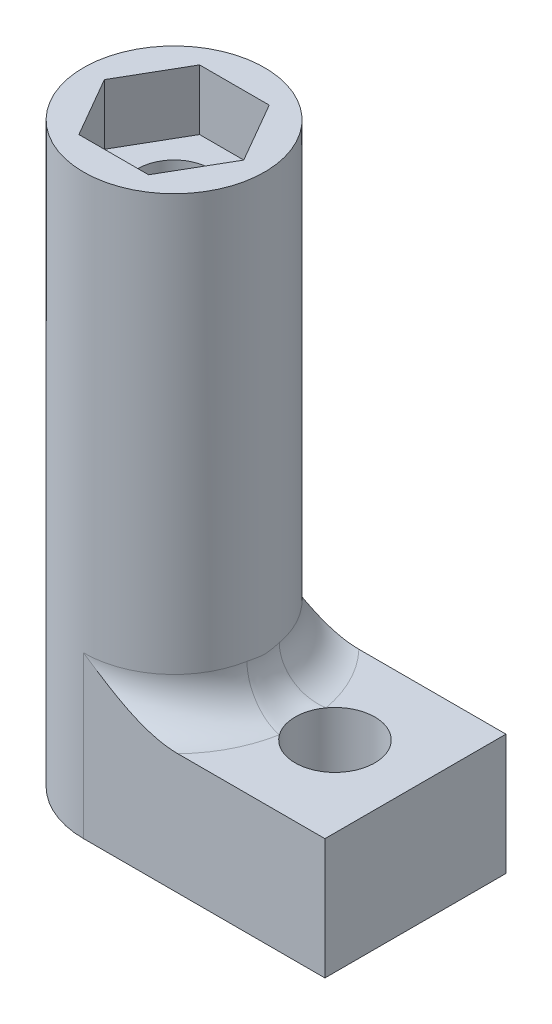
ISO-10303-21;
HEADER;
FILE_DESCRIPTION(('STEP AP214'),'2;1');
FILE_NAME('part.step','',(''),(''),'','','');
FILE_SCHEMA(('AUTOMOTIVE_DESIGN { 1 0 10303 214 1 1 1 1 }'));
ENDSEC;
DATA;
#1=APPLICATION_CONTEXT('core data for automotive mechanical design processes');
#2=APPLICATION_PROTOCOL_DEFINITION('international standard','automotive_design',2000,#1);
#3=PRODUCT_CONTEXT('',#1,'mechanical');
#4=PRODUCT('Part','Part','',(#3));
#5=PRODUCT_RELATED_PRODUCT_CATEGORY('part','',(#4));
#6=PRODUCT_DEFINITION_FORMATION('','',#4);
#7=PRODUCT_DEFINITION_CONTEXT('part definition',#1,'design');
#8=PRODUCT_DEFINITION('design','',#6,#7);
#9=PRODUCT_DEFINITION_SHAPE('','',#8);
#10=(LENGTH_UNIT() NAMED_UNIT(*) SI_UNIT(.MILLI.,.METRE.));
#11=(NAMED_UNIT(*) PLANE_ANGLE_UNIT() SI_UNIT($,.RADIAN.));
#12=(NAMED_UNIT(*) SI_UNIT($,.STERADIAN.) SOLID_ANGLE_UNIT());
#13=UNCERTAINTY_MEASURE_WITH_UNIT(LENGTH_MEASURE(1.E-05),#10,'distance_accuracy_value','');
#14=(GEOMETRIC_REPRESENTATION_CONTEXT(3) GLOBAL_UNCERTAINTY_ASSIGNED_CONTEXT((#13)) GLOBAL_UNIT_ASSIGNED_CONTEXT((#10,
#11,#12)) REPRESENTATION_CONTEXT('',''));
#15=CARTESIAN_POINT('',(0.,0.,0.));
#16=DIRECTION('',(0.,0.,1.));
#17=DIRECTION('',(1.,0.,0.));
#18=AXIS2_PLACEMENT_3D('',#15,#16,#17);
#19=CARTESIAN_POINT('',(0.,28.7,0.));
#20=DIRECTION('',(0.,-1.,0.));
#21=DIRECTION('',(0.,0.,-1.));
#22=AXIS2_PLACEMENT_3D('',#19,#20,#21);
#23=CYLINDRICAL_SURFACE('',#22,1.8);
#24=CARTESIAN_POINT('',(0.,0.,0.));
#25=DIRECTION('',(0.,1.,0.));
#26=DIRECTION('',(0.,0.,1.));
#27=AXIS2_PLACEMENT_3D('',#24,#25,#26);
#28=CIRCLE('',#27,1.8);
#29=CARTESIAN_POINT('',(0.,0.,1.8));
#30=VERTEX_POINT('',#29);
#31=EDGE_CURVE('E219',#30,#30,#28,.T.);
#32=ORIENTED_EDGE('',*,*,#31,.F.);
#33=EDGE_LOOP('',(#32));
#34=FACE_BOUND('',#33,.T.);
#35=CARTESIAN_POINT('',(0.,25.7,0.));
#36=DIRECTION('',(0.,1.,0.));
#37=DIRECTION('',(0.,0.,1.));
#38=AXIS2_PLACEMENT_3D('',#35,#36,#37);
#39=CIRCLE('',#38,1.8);
#40=CARTESIAN_POINT('',(0.,25.7,1.8));
#41=VERTEX_POINT('',#40);
#42=EDGE_CURVE('E44',#41,#41,#39,.T.);
#43=ORIENTED_EDGE('',*,*,#42,.T.);
#44=EDGE_LOOP('',(#43));
#45=FACE_BOUND('',#44,.T.);
#46=ADVANCED_FACE('F39',(#34,#45),#23,.F.);
#47=CARTESIAN_POINT('',(0.,28.7,0.));
#48=DIRECTION('',(0.,-1.,0.));
#49=DIRECTION('',(0.,0.,-1.));
#50=AXIS2_PLACEMENT_3D('',#47,#48,#49);
#51=CYLINDRICAL_SURFACE('',#50,4.5);
#52=CARTESIAN_POINT('',(0.,28.7,0.));
#53=DIRECTION('',(0.,1.,0.));
#54=DIRECTION('',(0.,0.,1.));
#55=AXIS2_PLACEMENT_3D('',#52,#53,#54);
#56=CIRCLE('',#55,4.5);
#57=CARTESIAN_POINT('',(0.,28.7,4.5));
#58=VERTEX_POINT('',#57);
#59=EDGE_CURVE('E229',#58,#58,#56,.T.);
#60=ORIENTED_EDGE('',*,*,#59,.F.);
#61=EDGE_LOOP('',(#60));
#62=FACE_BOUND('',#61,.T.);
#63=CARTESIAN_POINT('',(0.,8.,0.));
#64=DIRECTION('',(0.,1.,0.));
#65=DIRECTION('',(0.,0.,1.));
#66=AXIS2_PLACEMENT_3D('',#63,#64,#65);
#67=CIRCLE('',#66,4.5);
#68=CARTESIAN_POINT('',(4.42772307692308,8.,-0.80328597279103));
#69=VERTEX_POINT('',#68);
#70=CARTESIAN_POINT('',(0.,8.,-4.5));
#71=VERTEX_POINT('',#70);
#72=EDGE_CURVE('E244',#69,#71,#67,.T.);
#73=ORIENTED_EDGE('',*,*,#72,.T.);
#74=DIRECTION('',(0.,-1.,0.));
#75=VECTOR('',#74,1.);
#76=CARTESIAN_POINT('',(0.,6.,-4.5));
#77=LINE('',#76,#75);
#78=CARTESIAN_POINT('',(0.,0.,-4.5));
#79=VERTEX_POINT('',#78);
#80=EDGE_CURVE('E208',#71,#79,#77,.T.);
#81=ORIENTED_EDGE('',*,*,#80,.T.);
#82=CARTESIAN_POINT('',(0.,0.,0.));
#83=DIRECTION('',(0.,1.,0.));
#84=DIRECTION('',(0.,0.,1.));
#85=AXIS2_PLACEMENT_3D('',#82,#83,#84);
#86=CIRCLE('',#85,4.5);
#87=CARTESIAN_POINT('',(0.,0.,4.5));
#88=VERTEX_POINT('',#87);
#89=EDGE_CURVE('E228',#79,#88,#86,.T.);
#90=ORIENTED_EDGE('',*,*,#89,.T.);
#91=DIRECTION('',(0.,-1.,0.));
#92=VECTOR('',#91,1.);
#93=CARTESIAN_POINT('',(0.,6.,4.5));
#94=LINE('',#93,#92);
#95=CARTESIAN_POINT('',(0.,8.,4.5));
#96=VERTEX_POINT('',#95);
#97=EDGE_CURVE('E216',#96,#88,#94,.T.);
#98=ORIENTED_EDGE('',*,*,#97,.F.);
#99=CARTESIAN_POINT('',(0.,8.,0.));
#100=DIRECTION('',(0.,1.,0.));
#101=DIRECTION('',(0.,0.,1.));
#102=AXIS2_PLACEMENT_3D('',#99,#100,#101);
#103=CIRCLE('',#102,4.5);
#104=CARTESIAN_POINT('',(4.42772307692308,8.,0.80328597279103));
#105=VERTEX_POINT('',#104);
#106=EDGE_CURVE('E232',#96,#105,#103,.T.);
#107=ORIENTED_EDGE('',*,*,#106,.T.);
#108=CARTESIAN_POINT('',(4.32180042427934,7.92471685230345,1.25381062872305));
#109=CARTESIAN_POINT('',(4.47510886143326,5.71891832927366,0.725366816269322));
#110=CARTESIAN_POINT('',(6.62113793164979,6.,1.42096424883421));
#111=CARTESIAN_POINT('',(4.33523591986656,7.94212315378226,1.20753497902267));
#112=CARTESIAN_POINT('',(4.46203875305326,5.73817036351061,0.7490338847614));
#113=CARTESIAN_POINT('',(6.60282875781481,6.,1.40308878355294));
#114=CARTESIAN_POINT('',(4.34805817582105,7.95613015598346,1.16052585616582));
#115=CARTESIAN_POINT('',(4.45160158603136,5.76214166284144,0.769767952560044));
#116=CARTESIAN_POINT('',(6.58263930037659,6.,1.38290576627567));
#117=CARTESIAN_POINT('',(4.3722686689692,7.97805237679869,1.06565920912241));
#118=CARTESIAN_POINT('',(4.43604768902022,5.81701038067024,0.801181415969872));
#119=CARTESIAN_POINT('',(6.53870020330049,6.,1.33645318278953));
#120=CARTESIAN_POINT('',(4.38366226264996,7.9859909557779,1.01780567127564));
#121=CARTESIAN_POINT('',(4.43086731244596,5.84770296680902,0.811977813055372));
#122=CARTESIAN_POINT('',(6.51496464080291,6.,1.31020746852908));
#123=CARTESIAN_POINT('',(4.40491431850641,7.99660618725926,0.921503916477526));
#124=CARTESIAN_POINT('',(4.42548141469891,5.91357744562705,0.820328026151139));
#125=CARTESIAN_POINT('',(6.46399020166853,6.,1.25004372152428));
#126=CARTESIAN_POINT('',(4.41477278054274,7.99928283928371,0.87305569947219));
#127=CARTESIAN_POINT('',(4.42520607987305,5.94860022108697,0.818075814062893));
#128=CARTESIAN_POINT('',(6.43675132471371,6.,1.21612568808343));
#129=CARTESIAN_POINT('',(4.43290224829821,8.00046293973174,0.775776186303025));
#130=CARTESIAN_POINT('',(4.42853307521237,6.01980461750034,0.798233392250163));
#131=CARTESIAN_POINT('',(6.37948055108787,6.,1.13870351128674));
#132=CARTESIAN_POINT('',(4.44117075546338,7.99895987627455,0.726944410707282));
#133=CARTESIAN_POINT('',(4.43207096753054,6.05590388052615,0.780904070563555));
#134=CARTESIAN_POINT('',(6.34944436672314,6.,1.09518450709456));
#135=CARTESIAN_POINT('',(4.45657697338765,7.99289901335368,0.625866171314704));
#136=CARTESIAN_POINT('',(4.44184370002867,6.12809504240349,0.728543863395617));
#137=CARTESIAN_POINT('',(6.2861319446575,6.,0.993419862861029));
#138=CARTESIAN_POINT('',(4.46360246549781,7.98814413865479,0.573609207292893));
#139=CARTESIAN_POINT('',(4.4481951216501,6.16409787428863,0.69273330833869));
#140=CARTESIAN_POINT('',(6.25277322611751,6.,0.934385532128751));
#141=CARTESIAN_POINT('',(4.47581067378113,7.97727685072966,0.468932267480221));
#142=CARTESIAN_POINT('',(4.46155549040423,6.2297689751202,0.603912956766487));
#143=CARTESIAN_POINT('',(6.18800774417006,6.,0.801575262164426));
#144=CARTESIAN_POINT('',(4.48099253354884,7.97116380874278,0.416512227312223));
#145=CARTESIAN_POINT('',(4.46856234330022,6.25959826683878,0.551146805101261));
#146=CARTESIAN_POINT('',(6.1566018934854,6.,0.727792496768121));
#147=CARTESIAN_POINT('',(4.48950803560009,7.95964779875837,0.311580864753093));
#148=CARTESIAN_POINT('',(4.48123832986636,6.30989300008078,0.431696422450978));
#149=CARTESIAN_POINT('',(6.1006751688472,6.,0.565894183702304));
#150=CARTESIAN_POINT('',(4.49284516163185,7.95424350712863,0.259069903580956));
#151=CARTESIAN_POINT('',(4.4869552330347,6.33061723994682,0.365014961031779));
#152=CARTESIAN_POINT('',(6.07614136070009,6.,0.477806061485372));
#153=CARTESIAN_POINT('',(4.49767590330357,7.94597848143442,0.1538840689281));
#154=CARTESIAN_POINT('',(4.49551486225801,6.36079780815635,0.223000106056842));
#155=CARTESIAN_POINT('',(6.03921777904871,6.,0.291066790526567));
#156=CARTESIAN_POINT('',(4.49917052182178,7.94311636389997,0.101209300275258));
#157=CARTESIAN_POINT('',(4.49841517335574,6.37046886948605,0.147292316272926));
#158=CARTESIAN_POINT('',(6.0268213998892,6.,0.192421419910748));
#159=CARTESIAN_POINT('',(4.50030810473435,7.94096531105202,-0.0043358493317173));
#160=CARTESIAN_POINT('',(4.50058451138219,6.37774822959696,-0.00598485522887827));
#161=CARTESIAN_POINT('',(6.01747702604967,6.,-0.00796277259526935));
#162=CARTESIAN_POINT('',(4.49994627919025,7.94168561885266,-0.057206384229607));
#163=CARTESIAN_POINT('',(4.49986191039031,6.37538463692708,-0.0841784811282364));
#164=CARTESIAN_POINT('',(6.02056899342626,6.,-0.109708922750003));
#165=CARTESIAN_POINT('',(4.49736319607796,7.94645438068749,-0.162844082342372));
#166=CARTESIAN_POINT('',(4.49502164576732,6.35894958836597,-0.234932236048796));
#167=CARTESIAN_POINT('',(6.04141547754563,6.,-0.306984897528114));
#168=CARTESIAN_POINT('',(4.49514111523834,7.95050430825829,-0.215611189418985));
#169=CARTESIAN_POINT('',(4.49086477271746,6.34474392058083,-0.308047166703401));
#170=CARTESIAN_POINT('',(6.05917648614752,6.,-0.402511949660956));
#171=CARTESIAN_POINT('',(4.48884442408562,7.96050155064278,-0.321048710162209));
#172=CARTESIAN_POINT('',(4.4803068935065,6.30610423060991,-0.442865128437513));
#173=CARTESIAN_POINT('',(6.10491864478294,6.,-0.581070351799525));
#174=CARTESIAN_POINT('',(4.48476591922338,7.96645284642917,-0.373718685642546));
#175=CARTESIAN_POINT('',(4.47384260739006,6.28140899511805,-0.504787267728609));
#176=CARTESIAN_POINT('',(6.13292125604916,6.,-0.664074941335284));
#177=CARTESIAN_POINT('',(4.47475847645297,7.97823527742968,-0.478878876969836));
#178=CARTESIAN_POINT('',(4.46040129792344,6.2241786517087,-0.61318990521744));
#179=CARTESIAN_POINT('',(6.19369357568633,6.,-0.815060408123387));
#180=CARTESIAN_POINT('',(4.46883002553984,7.98406644383749,-0.531369136454469));
#181=CARTESIAN_POINT('',(4.45339483224755,6.19142135385402,-0.659572742060315));
#182=CARTESIAN_POINT('',(6.22646202824723,6.,-0.883045231267346));
#183=CARTESIAN_POINT('',(4.45901674316692,7.99087391904611,-0.606373175045757));
#184=CARTESIAN_POINT('',(4.44444530095814,6.14143084517406,-0.713275503726772));
#185=CARTESIAN_POINT('',(6.27369019983918,6.,-0.970123053579248));
#186=CARTESIAN_POINT('',(4.4558887517774,7.99272463971259,-0.628947637904187));
#187=CARTESIAN_POINT('',(4.44187172309975,6.12583751599385,-0.727890188669028));
#188=CARTESIAN_POINT('',(6.28795739854506,6.,-0.995023101981734));
#189=CARTESIAN_POINT('',(4.44928727565521,7.9958793669301,-0.674064227137648));
#190=CARTESIAN_POINT('',(4.43714916207272,6.09404582950308,-0.753847009694182));
#191=CARTESIAN_POINT('',(6.31634553103905,6.,-1.04233828127117));
#192=CARTESIAN_POINT('',(4.44581379016048,7.99718337227521,-0.696606353441243));
#193=CARTESIAN_POINT('',(4.43500394570287,6.07784319592814,-0.765160409118393));
#194=CARTESIAN_POINT('',(6.33046646450447,6.,-1.06475340667689));
#195=CARTESIAN_POINT('',(4.43488800383689,8.00005763490421,-0.764096355939794));
#196=CARTESIAN_POINT('',(4.42942377462029,6.02863782980248,-0.794250405769169));
#197=CARTESIAN_POINT('',(6.37224208492811,6.,-1.12844492389823));
#198=CARTESIAN_POINT('',(4.42691994992472,8.00059838017491,-0.80898754530961));
#199=CARTESIAN_POINT('',(4.42691272882663,5.99540220543019,-0.806808607347992));
#200=CARTESIAN_POINT('',(6.39936128069318,6.,-1.16625875091839));
#201=CARTESIAN_POINT('',(4.40964683609337,7.99792463659456,-0.898375176773174));
#202=CARTESIAN_POINT('',(4.42530713968846,5.93039150429781,-0.819576115140711));
#203=CARTESIAN_POINT('',(6.45101689165427,6.,-1.23405003826739));
#204=CARTESIAN_POINT('',(4.40034462109513,7.99471803701689,-0.942872250177293));
#205=CARTESIAN_POINT('',(4.42626203888824,5.89869358965328,-0.819600646386153));
#206=CARTESIAN_POINT('',(6.47555861482139,6.,-1.26404379979915));
#207=CARTESIAN_POINT('',(4.38042824262163,7.98378447080364,-1.03147018224221));
#208=CARTESIAN_POINT('',(4.43225679565825,5.83887818173679,-0.80908606857316));
#209=CARTESIAN_POINT('',(6.52180392693491,6.,-1.31777101673479));
#210=CARTESIAN_POINT('',(4.3698093697282,7.97604088580106,-1.07556897591413));
#211=CARTESIAN_POINT('',(4.43736376326885,5.81090117842068,-0.798367153839786));
#212=CARTESIAN_POINT('',(6.54349672117354,6.,-1.3414809893378));
#213=CARTESIAN_POINT('',(4.35858563114795,7.96564735635359,-1.11925479491967));
#214=CARTESIAN_POINT('',(4.44480341319623,5.78621769971489,-0.783506770706757));
#215=CARTESIAN_POINT('',(6.56351217936984,6.,-1.36268218641809));
#216=(BOUNDED_SURFACE() B_SPLINE_SURFACE(3,2,((#108,#109,#110),(#111,#112,#113),(#114,#115,
#116),(#117,#118,#119),(#120,#121,#122),(#123,#124,#125),(#126,#127,#128),(#129,#130,#131),
(#132,#133,#134),(#135,#136,#137),(#138,#139,#140),(#141,#142,#143),(#144,#145,#146),(#147,#148,
#149),(#150,#151,#152),(#153,#154,#155),(#156,#157,#158),(#159,#160,#161),(#162,#163,#164),
(#165,#166,#167),(#168,#169,#170),(#171,#172,#173),(#174,#175,#176),(#177,#178,#179),(#180,#181,
#182),(#183,#184,#185),(#186,#187,#188),(#189,#190,#191),(#192,#193,#194),(#195,#196,#197),
(#198,#199,#200),(#201,#202,#203),(#204,#205,#206),(#207,#208,#209),(#210,#211,#212),(#213,#214,
#215)),.UNSPECIFIED.,.F.,.F.,.F.) B_SPLINE_SURFACE_WITH_KNOTS((4,2,2,2,2,2,2,2,2,2,2,2,2,2,2,2,
2,4),(3,3),(0.,0.21503532792247,0.429238650825709,0.643441993174441,0.857979245277317,
1.08682698202551,1.31578088492312,1.54430092214241,1.77269652073123,2.00168171432519,
2.2307683008213,2.4603377137437,2.68984674383218,2.78875252927018,2.88765853286951,
3.08512177358291,3.28217004335128,3.47994462694238),(0.,1.),
.UNSPECIFIED.) GEOMETRIC_REPRESENTATION_ITEM() RATIONAL_B_SPLINE_SURFACE(((1.,0.660519290641002,
1.),(1.,0.663804819785435,1.),(1.,0.667688306752048,1.),(1.,0.676513938999184,1.),(1.,
0.681451930029375,1.),(1.,0.692276608244784,1.),(1.,0.698163295516125,1.),(1.,0.710607402000421,
1.),(1.,0.717165852475705,1.),(1.,0.73094317488497,1.),(1.,0.738176918255722,1.),(1.,
0.752104710537283,1.),(1.,0.758798507518311,1.),(1.,0.770619770639632,1.),(1.,0.775750180926034,
1.),(1.,0.783435848715463,1.),(1.,0.785992506974603,1.),(1.,0.787922015486865,1.),(1.,
0.787286629816923,1.),(1.,0.782973418654017,1.),(1.,0.779294246116418,1.),(1.,0.769721500730478,
1.),(1.,0.7638232771209,1.),(1.,0.750887668903448,1.),(1.,0.743850584333137,1.),(1.,
0.733635508547674,1.),(1.,0.730540254675541,1.),(1.,0.724370159771713,1.),(1.,0.72129531878506,
1.),(1.,0.712193287651683,1.),(1.,0.70627735299664,1.),(1.,0.69508264641754,1.),(1.,
0.68980256161653,1.),(1.,0.680025589146032,1.),(1.,0.675531660054101,1.),(1.,0.671531481599833,1.))) REPRESENTATION_ITEM('') SURFACE());
#217=CARTESIAN_POINT('',(4.32180042427934,7.92471685230345,1.25381062872305));
#218=CARTESIAN_POINT('',(4.33523591986656,7.94212315378226,1.20753497902267));
#219=CARTESIAN_POINT('',(4.34805817582105,7.95613015598346,1.16052585616582));
#220=CARTESIAN_POINT('',(4.3722686689692,7.97805237679869,1.06565920912241));
#221=CARTESIAN_POINT('',(4.38366226264996,7.9859909557779,1.01780567127564));
#222=CARTESIAN_POINT('',(4.40491431850641,7.99660618725926,0.921503916477526));
#223=CARTESIAN_POINT('',(4.41477278054274,7.99928283928371,0.87305569947219));
#224=CARTESIAN_POINT('',(4.43290224829821,8.00046293973174,0.775776186303025));
#225=CARTESIAN_POINT('',(4.44117075546338,7.99895987627455,0.726944410707282));
#226=CARTESIAN_POINT('',(4.45657697338766,7.99289901335368,0.625866171314704));
#227=CARTESIAN_POINT('',(4.46360246549781,7.98814413865479,0.573609207292893));
#228=CARTESIAN_POINT('',(4.47581067378113,7.97727685072966,0.468932267480221));
#229=CARTESIAN_POINT('',(4.48099253354884,7.97116380874278,0.416512227312223));
#230=CARTESIAN_POINT('',(4.48950803560009,7.95964779875837,0.311580864753093));
#231=CARTESIAN_POINT('',(4.49284516163185,7.95424350712863,0.259069903580956));
#232=CARTESIAN_POINT('',(4.49767590330357,7.94597848143442,0.1538840689281));
#233=CARTESIAN_POINT('',(4.49917052182179,7.94311636389997,0.101209300275258));
#234=CARTESIAN_POINT('',(4.50030810473435,7.94096531105202,-0.00433584933171725));
#235=CARTESIAN_POINT('',(4.49994627919025,7.94168561885266,-0.0572063842296069));
#236=CARTESIAN_POINT('',(4.49736319607796,7.94645438068749,-0.162844082342372));
#237=CARTESIAN_POINT('',(4.49514111523834,7.95050430825829,-0.215611189418986));
#238=CARTESIAN_POINT('',(4.48884442408562,7.96050155064278,-0.321048710162209));
#239=CARTESIAN_POINT('',(4.48476591922338,7.96645284642917,-0.373718685642546));
#240=CARTESIAN_POINT('',(4.47475847645297,7.97823527742968,-0.478878876969836));
#241=CARTESIAN_POINT('',(4.46883002553984,7.98406644383749,-0.531369136454469));
#242=CARTESIAN_POINT('',(4.45901674316692,7.99087391904611,-0.606373175045757));
#243=CARTESIAN_POINT('',(4.4558887517774,7.99272463971259,-0.628947637904187));
#244=CARTESIAN_POINT('',(4.44928727565521,7.9958793669301,-0.674064227137648));
#245=CARTESIAN_POINT('',(4.44581379016048,7.99718337227521,-0.696606353441243));
#246=CARTESIAN_POINT('',(4.43488800383689,8.00005763490421,-0.764096355939795));
#247=CARTESIAN_POINT('',(4.42691994992472,8.00059838017491,-0.80898754530961));
#248=CARTESIAN_POINT('',(4.40964683609337,7.99792463659456,-0.898375176773174));
#249=CARTESIAN_POINT('',(4.40034462109513,7.99471803701689,-0.942872250177293));
#250=CARTESIAN_POINT('',(4.38042824262163,7.98378447080364,-1.03147018224221));
#251=CARTESIAN_POINT('',(4.36980936972821,7.97604088580106,-1.07556897591413));
#252=CARTESIAN_POINT('',(4.35858563114795,7.96564735635359,-1.11925479491967));
#253=B_SPLINE_CURVE_WITH_KNOTS('',3,(#217,#218,#219,#220,#221,#222,#223,#224,#225,#226,#227,
#228,#229,#230,#231,#232,#233,#234,#235,#236,#237,#238,#239,#240,#241,#242,#243,#244,#245,#246,
#247,#248,#249,#250,#251,#252),.UNSPECIFIED.,.F.,.F.,(4,2,2,2,2,2,2,2,2,2,2,2,2,2,2,2,2,4),(0.,
0.21503532792247,0.429238650825709,0.643441993174441,0.857979245277317,1.08682698202551,
1.31578088492312,1.54430092214241,1.77269652073123,2.00168171432519,2.2307683008213,
2.4603377137437,2.68984674383218,2.78875252927018,2.88765853286951,3.08512177358291,
3.28217004335128,3.47994462694238),.UNSPECIFIED.);
#254=EDGE_CURVE('E236',#105,#69,#253,.T.);
#255=ORIENTED_EDGE('',*,*,#254,.T.);
#256=EDGE_LOOP('',(#73,#81,#90,#98,#107,#255));
#257=FACE_BOUND('',#256,.T.);
#258=ADVANCED_FACE('F246',(#62,#257),#51,.T.);
#259=CARTESIAN_POINT('',(0.,28.7,0.));
#260=DIRECTION('',(0.,1.,0.));
#261=DIRECTION('',(0.,0.,1.));
#262=AXIS2_PLACEMENT_3D('',#259,#260,#261);
#263=PLANE('',#262);
#264=DIRECTION('',(-0.5,0.,-0.866025403784438));
#265=VECTOR('',#264,1.);
#266=CARTESIAN_POINT('',(3.46410161513775,28.7,0.));
#267=LINE('',#266,#265);
#268=CARTESIAN_POINT('',(3.46410161513775,28.7,0.));
#269=VERTEX_POINT('',#268);
#270=CARTESIAN_POINT('',(1.73205080756888,28.7,-3.));
#271=VERTEX_POINT('',#270);
#272=EDGE_CURVE('E57',#269,#271,#267,.T.);
#273=ORIENTED_EDGE('',*,*,#272,.F.);
#274=DIRECTION('',(0.5,0.,-0.866025403784439));
#275=VECTOR('',#274,1.);
#276=CARTESIAN_POINT('',(1.73205080756888,28.7,3.));
#277=LINE('',#276,#275);
#278=CARTESIAN_POINT('',(1.73205080756888,28.7,3.));
#279=VERTEX_POINT('',#278);
#280=EDGE_CURVE('E157',#279,#269,#277,.T.);
#281=ORIENTED_EDGE('',*,*,#280,.F.);
#282=DIRECTION('',(1.,0.,0.));
#283=VECTOR('',#282,1.);
#284=CARTESIAN_POINT('',(-1.73205080756888,28.7,3.));
#285=LINE('',#284,#283);
#286=CARTESIAN_POINT('',(-1.73205080756888,28.7,3.));
#287=VERTEX_POINT('',#286);
#288=EDGE_CURVE('E160',#287,#279,#285,.T.);
#289=ORIENTED_EDGE('',*,*,#288,.F.);
#290=DIRECTION('',(0.5,0.,0.866025403784438));
#291=VECTOR('',#290,1.);
#292=CARTESIAN_POINT('',(-3.46410161513775,28.7,0.));
#293=LINE('',#292,#291);
#294=CARTESIAN_POINT('',(-3.46410161513775,28.7,0.));
#295=VERTEX_POINT('',#294);
#296=EDGE_CURVE('E176',#295,#287,#293,.T.);
#297=ORIENTED_EDGE('',*,*,#296,.F.);
#298=DIRECTION('',(-0.499999999999999,0.,0.866025403784439));
#299=VECTOR('',#298,1.);
#300=CARTESIAN_POINT('',(-1.73205080756888,28.7,-3.));
#301=LINE('',#300,#299);
#302=CARTESIAN_POINT('',(-1.73205080756888,28.7,-3.));
#303=VERTEX_POINT('',#302);
#304=EDGE_CURVE('E173',#303,#295,#301,.T.);
#305=ORIENTED_EDGE('',*,*,#304,.F.);
#306=DIRECTION('',(-1.,0.,0.));
#307=VECTOR('',#306,1.);
#308=CARTESIAN_POINT('',(1.73205080756888,28.7,-3.));
#309=LINE('',#308,#307);
#310=EDGE_CURVE('E171',#271,#303,#309,.T.);
#311=ORIENTED_EDGE('',*,*,#310,.F.);
#312=EDGE_LOOP('',(#273,#281,#289,#297,#305,#311));
#313=FACE_BOUND('',#312,.T.);
#314=ORIENTED_EDGE('',*,*,#59,.T.);
#315=EDGE_LOOP('',(#314));
#316=FACE_BOUND('',#315,.T.);
#317=ADVANCED_FACE('F306',(#313,#316),#263,.T.);
#318=CARTESIAN_POINT('',(0.,0.,0.));
#319=DIRECTION('',(0.,1.,0.));
#320=DIRECTION('',(0.,0.,1.));
#321=AXIS2_PLACEMENT_3D('',#318,#319,#320);
#322=PLANE('',#321);
#323=CARTESIAN_POINT('',(8.,0.,0.));
#324=DIRECTION('',(0.,-1.,0.));
#325=DIRECTION('',(0.,0.,-1.));
#326=AXIS2_PLACEMENT_3D('',#323,#324,#325);
#327=CIRCLE('',#326,1.98);
#328=CARTESIAN_POINT('',(8.,0.,-1.98));
#329=VERTEX_POINT('',#328);
#330=EDGE_CURVE('E190',#329,#329,#327,.T.);
#331=ORIENTED_EDGE('',*,*,#330,.F.);
#332=EDGE_LOOP('',(#331));
#333=FACE_BOUND('',#332,.T.);
#334=ORIENTED_EDGE('',*,*,#89,.F.);
#335=DIRECTION('',(1.,0.,0.));
#336=VECTOR('',#335,1.);
#337=CARTESIAN_POINT('',(12.,0.,-4.5));
#338=LINE('',#337,#336);
#339=CARTESIAN_POINT('',(12.,0.,-4.5));
#340=VERTEX_POINT('',#339);
#341=EDGE_CURVE('E198',#79,#340,#338,.T.);
#342=ORIENTED_EDGE('',*,*,#341,.T.);
#343=DIRECTION('',(0.,0.,1.));
#344=VECTOR('',#343,1.);
#345=CARTESIAN_POINT('',(12.,0.,4.5));
#346=LINE('',#345,#344);
#347=CARTESIAN_POINT('',(12.,0.,4.5));
#348=VERTEX_POINT('',#347);
#349=EDGE_CURVE('E211',#340,#348,#346,.T.);
#350=ORIENTED_EDGE('',*,*,#349,.T.);
#351=DIRECTION('',(-1.,0.,0.));
#352=VECTOR('',#351,1.);
#353=CARTESIAN_POINT('',(0.,0.,4.5));
#354=LINE('',#353,#352);
#355=EDGE_CURVE('E202',#348,#88,#354,.T.);
#356=ORIENTED_EDGE('',*,*,#355,.T.);
#357=EDGE_LOOP('',(#334,#342,#350,#356));
#358=FACE_BOUND('',#357,.T.);
#359=ORIENTED_EDGE('',*,*,#31,.T.);
#360=EDGE_LOOP('',(#359));
#361=FACE_BOUND('',#360,.T.);
#362=ADVANCED_FACE('F293',(#333,#358,#361),#322,.F.);
#363=CARTESIAN_POINT('',(0.,6.,4.5));
#364=DIRECTION('',(0.,0.,1.));
#365=DIRECTION('',(1.,0.,0.));
#366=AXIS2_PLACEMENT_3D('',#363,#364,#365);
#367=PLANE('',#366);
#368=ORIENTED_EDGE('',*,*,#355,.F.);
#369=DIRECTION('',(0.,-1.,0.));
#370=VECTOR('',#369,1.);
#371=CARTESIAN_POINT('',(12.,6.,4.5));
#372=LINE('',#371,#370);
#373=CARTESIAN_POINT('',(12.,6.,4.5));
#374=VERTEX_POINT('',#373);
#375=EDGE_CURVE('E220',#374,#348,#372,.T.);
#376=ORIENTED_EDGE('',*,*,#375,.F.);
#377=DIRECTION('',(-1.,0.,0.));
#378=VECTOR('',#377,1.);
#379=CARTESIAN_POINT('',(0.,6.,4.5));
#380=LINE('',#379,#378);
#381=CARTESIAN_POINT('',(4.69041575982343,6.,4.5));
#382=VERTEX_POINT('',#381);
#383=EDGE_CURVE('E205',#374,#382,#380,.T.);
#384=ORIENTED_EDGE('',*,*,#383,.T.);
#385=CARTESIAN_POINT('',(4.69041575982343,6.,4.5));
#386=CARTESIAN_POINT('',(4.56338799354628,6.00001629945652,4.5));
#387=CARTESIAN_POINT('',(4.43651728645573,6.00629690124301,4.5));
#388=CARTESIAN_POINT('',(4.18405485721427,6.0299789451764,4.5));
#389=CARTESIAN_POINT('',(4.05846108370906,6.04735810798877,4.5));
#390=CARTESIAN_POINT('',(3.68861101421824,6.11330867880104,4.5));
#391=CARTESIAN_POINT('',(3.44683013416413,6.17579614695564,4.5));
#392=CARTESIAN_POINT('',(2.92162772576583,6.34549368961101,4.5));
#393=CARTESIAN_POINT('',(2.64048069270811,6.45944513803349,4.5));
#394=CARTESIAN_POINT('',(2.09122390251144,6.71566547248007,4.5));
#395=CARTESIAN_POINT('',(1.82314044482931,6.85798876486459,4.5));
#396=CARTESIAN_POINT('',(1.2949255005519,7.16131052871333,4.5));
#397=CARTESIAN_POINT('',(1.03488315666197,7.32246027688379,4.5));
#398=CARTESIAN_POINT('',(0.520265873478311,7.65324006647528,4.5));
#399=CARTESIAN_POINT('',(0.26569267806667,7.82287275701892,4.5));
#400=CARTESIAN_POINT('',(0.00744208331612124,7.99503861232405,4.5));
#401=CARTESIAN_POINT('',(0.00372104126172573,7.99751930705951,4.5));
#402=CARTESIAN_POINT('',(0.,8.,4.5));
#403=B_SPLINE_CURVE_WITH_KNOTS('',3,(#385,#386,#387,#388,#389,#390,#391,#392,#393,#394,#395,
#396,#397,#398,#399,#400,#401,#402),.UNSPECIFIED.,.F.,.F.,(4,2,2,2,2,2,2,2,4),(0.,
0.380689018588808,0.760616231132244,1.5072612716087,2.4150430104358,3.32458256973669,
4.24201127100227,5.15972828567752,5.17314469354255),.UNSPECIFIED.);
#404=EDGE_CURVE('E11',#382,#96,#403,.T.);
#405=ORIENTED_EDGE('',*,*,#404,.T.);
#406=ORIENTED_EDGE('',*,*,#97,.T.);
#407=EDGE_LOOP('',(#368,#376,#384,#405,#406));
#408=FACE_BOUND('',#407,.T.);
#409=ADVANCED_FACE('F288',(#408),#367,.T.);
#410=CARTESIAN_POINT('',(12.,6.,4.5));
#411=DIRECTION('',(1.,0.,0.));
#412=DIRECTION('',(0.,0.,-1.));
#413=AXIS2_PLACEMENT_3D('',#410,#411,#412);
#414=PLANE('',#413);
#415=ORIENTED_EDGE('',*,*,#349,.F.);
#416=DIRECTION('',(0.,-1.,0.));
#417=VECTOR('',#416,1.);
#418=CARTESIAN_POINT('',(12.,6.,-4.5));
#419=LINE('',#418,#417);
#420=CARTESIAN_POINT('',(12.,6.,-4.5));
#421=VERTEX_POINT('',#420);
#422=EDGE_CURVE('E222',#421,#340,#419,.T.);
#423=ORIENTED_EDGE('',*,*,#422,.F.);
#424=DIRECTION('',(0.,0.,1.));
#425=VECTOR('',#424,1.);
#426=CARTESIAN_POINT('',(12.,6.,4.5));
#427=LINE('',#426,#425);
#428=EDGE_CURVE('E201',#421,#374,#427,.T.);
#429=ORIENTED_EDGE('',*,*,#428,.T.);
#430=ORIENTED_EDGE('',*,*,#375,.T.);
#431=EDGE_LOOP('',(#415,#423,#429,#430));
#432=FACE_BOUND('',#431,.T.);
#433=ADVANCED_FACE('F292',(#432),#414,.T.);
#434=CARTESIAN_POINT('',(12.,6.,-4.5));
#435=DIRECTION('',(0.,0.,-1.));
#436=DIRECTION('',(-1.,0.,0.));
#437=AXIS2_PLACEMENT_3D('',#434,#435,#436);
#438=PLANE('',#437);
#439=ORIENTED_EDGE('',*,*,#341,.F.);
#440=ORIENTED_EDGE('',*,*,#80,.F.);
#441=CARTESIAN_POINT('',(4.69041575982343,6.,-4.5));
#442=CARTESIAN_POINT('',(4.5633879935463,6.00001629945652,-4.5));
#443=CARTESIAN_POINT('',(4.43651728645577,6.00629690124301,-4.5));
#444=CARTESIAN_POINT('',(4.18405485721435,6.02997894517639,-4.5));
#445=CARTESIAN_POINT('',(4.05846108370916,6.04735810798876,-4.5));
#446=CARTESIAN_POINT('',(3.68861101421831,6.11330867880102,-4.5));
#447=CARTESIAN_POINT('',(3.44683013416417,6.17579614695562,-4.5));
#448=CARTESIAN_POINT('',(2.92162772576583,6.34549368961101,-4.5));
#449=CARTESIAN_POINT('',(2.64048069270811,6.4594451380335,-4.5));
#450=CARTESIAN_POINT('',(2.0912239025114,6.71566547248008,-4.5));
#451=CARTESIAN_POINT('',(1.82314044482924,6.85798876486457,-4.5));
#452=CARTESIAN_POINT('',(1.29492550055187,7.1613105287134,-4.5));
#453=CARTESIAN_POINT('',(1.03488315666202,7.32246027688396,-4.5));
#454=CARTESIAN_POINT('',(0.520265873478196,7.65324006647515,-4.5));
#455=CARTESIAN_POINT('',(0.265692678066311,7.82287275701839,-4.5));
#456=CARTESIAN_POINT('',(0.00744208331611692,7.99503861232403,-4.5));
#457=CARTESIAN_POINT('',(0.00372104126172399,7.9975193070595,-4.5));
#458=CARTESIAN_POINT('',(0.,8.,-4.5));
#459=B_SPLINE_CURVE_WITH_KNOTS('',3,(#441,#442,#443,#444,#445,#446,#447,#448,#449,#450,#451,
#452,#453,#454,#455,#456,#457,#458),.UNSPECIFIED.,.F.,.F.,(4,2,2,2,2,2,2,2,4),(0.,
0.380689018588746,0.760616231132134,1.50726127160869,2.41504301043581,3.32458256973677,
4.24201127100232,5.15972828567752,5.17314469354255),.UNSPECIFIED.);
#460=CARTESIAN_POINT('',(4.69041575982343,6.,-4.5));
#461=VERTEX_POINT('',#460);
#462=EDGE_CURVE('E49',#71,#461,#459,.F.);
#463=ORIENTED_EDGE('',*,*,#462,.T.);
#464=DIRECTION('',(1.,0.,0.));
#465=VECTOR('',#464,1.);
#466=CARTESIAN_POINT('',(12.,6.,-4.5));
#467=LINE('',#466,#465);
#468=EDGE_CURVE('E199',#461,#421,#467,.T.);
#469=ORIENTED_EDGE('',*,*,#468,.T.);
#470=ORIENTED_EDGE('',*,*,#422,.T.);
#471=EDGE_LOOP('',(#439,#440,#463,#469,#470));
#472=FACE_BOUND('',#471,.T.);
#473=ADVANCED_FACE('F298',(#472),#438,.T.);
#474=CARTESIAN_POINT('',(0.,6.,0.));
#475=DIRECTION('',(0.,1.,0.));
#476=DIRECTION('',(0.,0.,1.));
#477=AXIS2_PLACEMENT_3D('',#474,#475,#476);
#478=PLANE('',#477);
#479=ORIENTED_EDGE('',*,*,#468,.F.);
#480=CARTESIAN_POINT('',(0.,6.,0.));
#481=DIRECTION('',(0.,1.,0.));
#482=DIRECTION('',(0.,0.,1.));
#483=AXIS2_PLACEMENT_3D('',#480,#481,#482);
#484=CIRCLE('',#483,6.5);
#485=CARTESIAN_POINT('',(6.3956,6.,-1.16030196069815));
#486=VERTEX_POINT('',#485);
#487=EDGE_CURVE('E367',#461,#486,#484,.F.);
#488=ORIENTED_EDGE('',*,*,#487,.T.);
#489=CARTESIAN_POINT('',(8.,6.,0.));
#490=DIRECTION('',(0.,1.,0.));
#491=DIRECTION('',(0.,0.,1.));
#492=AXIS2_PLACEMENT_3D('',#489,#490,#491);
#493=CIRCLE('',#492,1.97999999999999);
#494=CARTESIAN_POINT('',(6.3956,6.,1.16030196069815));
#495=VERTEX_POINT('',#494);
#496=EDGE_CURVE('E193',#495,#486,#493,.T.);
#497=ORIENTED_EDGE('',*,*,#496,.F.);
#498=CARTESIAN_POINT('',(0.,6.,0.));
#499=DIRECTION('',(0.,1.,0.));
#500=DIRECTION('',(0.,0.,1.));
#501=AXIS2_PLACEMENT_3D('',#498,#499,#500);
#502=CIRCLE('',#501,6.5);
#503=EDGE_CURVE('E363',#495,#382,#502,.F.);
#504=ORIENTED_EDGE('',*,*,#503,.T.);
#505=ORIENTED_EDGE('',*,*,#383,.F.);
#506=ORIENTED_EDGE('',*,*,#428,.F.);
#507=EDGE_LOOP('',(#479,#488,#497,#504,#505,#506));
#508=FACE_BOUND('',#507,.T.);
#509=ADVANCED_FACE('F295',(#508),#478,.T.);
#510=CARTESIAN_POINT('',(8.,0.,0.));
#511=DIRECTION('',(0.,-1.,0.));
#512=DIRECTION('',(0.,0.,-1.));
#513=AXIS2_PLACEMENT_3D('',#510,#511,#512);
#514=CYLINDRICAL_SURFACE('',#513,1.97999999999999);
#515=EDGE_CURVE('E195',#486,#495,#493,.T.);
#516=ORIENTED_EDGE('',*,*,#515,.T.);
#517=ORIENTED_EDGE('',*,*,#496,.T.);
#518=EDGE_LOOP('',(#516,#517));
#519=FACE_BOUND('',#518,.T.);
#520=ORIENTED_EDGE('',*,*,#330,.T.);
#521=EDGE_LOOP('',(#520));
#522=FACE_BOUND('',#521,.T.);
#523=ADVANCED_FACE('F345',(#519,#522),#514,.F.);
#524=CARTESIAN_POINT('',(0.,8.,0.));
#525=DIRECTION('',(0.,1.,0.));
#526=DIRECTION('',(0.,0.,1.));
#527=AXIS2_PLACEMENT_3D('',#524,#525,#526);
#528=TOROIDAL_SURFACE('',#527,6.5,2.);
#529=ORIENTED_EDGE('',*,*,#462,.F.);
#530=ORIENTED_EDGE('',*,*,#72,.F.);
#531=CARTESIAN_POINT('',(6.3956,8.,-1.16030196069815));
#532=DIRECTION('',(-0.178507993953562,0.,-0.983938461538462));
#533=DIRECTION('',(-0.983938461538462,0.,0.178507993953562));
#534=AXIS2_PLACEMENT_3D('',#531,#532,#533);
#535=CIRCLE('',#534,2.);
#536=EDGE_CURVE('E194',#486,#69,#535,.T.);
#537=ORIENTED_EDGE('',*,*,#536,.F.);
#538=ORIENTED_EDGE('',*,*,#487,.F.);
#539=EDGE_LOOP('',(#529,#530,#537,#538));
#540=FACE_BOUND('',#539,.T.);
#541=ADVANCED_FACE('F41',(#540),#528,.F.);
#542=ORIENTED_EDGE('',*,*,#536,.T.);
#543=ORIENTED_EDGE('',*,*,#254,.F.);
#544=CARTESIAN_POINT('',(6.3956,8.,1.16030196069815));
#545=DIRECTION('',(-0.178507993953562,0.,0.983938461538462));
#546=DIRECTION('',(0.983938461538462,0.,0.178507993953562));
#547=AXIS2_PLACEMENT_3D('',#544,#545,#546);
#548=CIRCLE('',#547,2.);
#549=EDGE_CURVE('E275',#495,#105,#548,.F.);
#550=ORIENTED_EDGE('',*,*,#549,.F.);
#551=ORIENTED_EDGE('',*,*,#515,.F.);
#552=EDGE_LOOP('',(#542,#543,#550,#551));
#553=FACE_BOUND('',#552,.T.);
#554=ADVANCED_FACE('F254',(#553),#216,.F.);
#555=CARTESIAN_POINT('',(0.,8.,0.));
#556=DIRECTION('',(0.,1.,0.));
#557=DIRECTION('',(0.,0.,1.));
#558=AXIS2_PLACEMENT_3D('',#555,#556,#557);
#559=TOROIDAL_SURFACE('',#558,6.5,2.);
#560=ORIENTED_EDGE('',*,*,#404,.F.);
#561=ORIENTED_EDGE('',*,*,#503,.F.);
#562=ORIENTED_EDGE('',*,*,#549,.T.);
#563=ORIENTED_EDGE('',*,*,#106,.F.);
#564=EDGE_LOOP('',(#560,#561,#562,#563));
#565=FACE_BOUND('',#564,.T.);
#566=ADVANCED_FACE('F252',(#565),#559,.F.);
#567=CARTESIAN_POINT('',(3.46410161513775,25.7,0.));
#568=DIRECTION('',(0.866025403784439,0.,-0.5));
#569=DIRECTION('',(-0.5,0.,-0.866025403784439));
#570=AXIS2_PLACEMENT_3D('',#567,#568,#569);
#571=PLANE('',#570);
#572=ORIENTED_EDGE('',*,*,#272,.T.);
#573=DIRECTION('',(0.,1.,0.));
#574=VECTOR('',#573,1.);
#575=CARTESIAN_POINT('',(1.73205080756888,25.7,-3.));
#576=LINE('',#575,#574);
#577=CARTESIAN_POINT('',(1.73205080756888,25.7,-3.));
#578=VERTEX_POINT('',#577);
#579=EDGE_CURVE('E134',#578,#271,#576,.T.);
#580=ORIENTED_EDGE('',*,*,#579,.F.);
#581=DIRECTION('',(-0.5,0.,-0.866025403784438));
#582=VECTOR('',#581,1.);
#583=CARTESIAN_POINT('',(3.46410161513775,25.7,0.));
#584=LINE('',#583,#582);
#585=CARTESIAN_POINT('',(3.46410161513775,25.7,0.));
#586=VERTEX_POINT('',#585);
#587=EDGE_CURVE('E138',#586,#578,#584,.T.);
#588=ORIENTED_EDGE('',*,*,#587,.F.);
#589=DIRECTION('',(0.,1.,0.));
#590=VECTOR('',#589,1.);
#591=CARTESIAN_POINT('',(3.46410161513775,25.7,0.));
#592=LINE('',#591,#590);
#593=EDGE_CURVE('E181',#586,#269,#592,.T.);
#594=ORIENTED_EDGE('',*,*,#593,.T.);
#595=EDGE_LOOP('',(#572,#580,#588,#594));
#596=FACE_BOUND('',#595,.T.);
#597=ADVANCED_FACE('F136',(#596),#571,.F.);
#598=CARTESIAN_POINT('',(1.73205080756888,25.7,3.));
#599=DIRECTION('',(0.866025403784439,0.,0.5));
#600=DIRECTION('',(0.5,0.,-0.866025403784439));
#601=AXIS2_PLACEMENT_3D('',#598,#599,#600);
#602=PLANE('',#601);
#603=ORIENTED_EDGE('',*,*,#280,.T.);
#604=ORIENTED_EDGE('',*,*,#593,.F.);
#605=DIRECTION('',(0.5,0.,-0.866025403784439));
#606=VECTOR('',#605,1.);
#607=CARTESIAN_POINT('',(1.73205080756888,25.7,3.));
#608=LINE('',#607,#606);
#609=CARTESIAN_POINT('',(1.73205080756888,25.7,3.));
#610=VERTEX_POINT('',#609);
#611=EDGE_CURVE('E144',#610,#586,#608,.T.);
#612=ORIENTED_EDGE('',*,*,#611,.F.);
#613=DIRECTION('',(0.,1.,0.));
#614=VECTOR('',#613,1.);
#615=CARTESIAN_POINT('',(1.73205080756888,25.7,3.));
#616=LINE('',#615,#614);
#617=EDGE_CURVE('E183',#610,#279,#616,.T.);
#618=ORIENTED_EDGE('',*,*,#617,.T.);
#619=EDGE_LOOP('',(#603,#604,#612,#618));
#620=FACE_BOUND('',#619,.T.);
#621=ADVANCED_FACE('F329',(#620),#602,.F.);
#622=CARTESIAN_POINT('',(-1.73205080756888,25.7,3.));
#623=DIRECTION('',(0.,0.,1.));
#624=DIRECTION('',(1.,0.,0.));
#625=AXIS2_PLACEMENT_3D('',#622,#623,#624);
#626=PLANE('',#625);
#627=ORIENTED_EDGE('',*,*,#288,.T.);
#628=ORIENTED_EDGE('',*,*,#617,.F.);
#629=DIRECTION('',(1.,0.,0.));
#630=VECTOR('',#629,1.);
#631=CARTESIAN_POINT('',(-1.73205080756888,25.7,3.));
#632=LINE('',#631,#630);
#633=CARTESIAN_POINT('',(-1.73205080756888,25.7,3.));
#634=VERTEX_POINT('',#633);
#635=EDGE_CURVE('E167',#634,#610,#632,.T.);
#636=ORIENTED_EDGE('',*,*,#635,.F.);
#637=DIRECTION('',(0.,1.,0.));
#638=VECTOR('',#637,1.);
#639=CARTESIAN_POINT('',(-1.73205080756888,25.7,3.));
#640=LINE('',#639,#638);
#641=EDGE_CURVE('E185',#634,#287,#640,.T.);
#642=ORIENTED_EDGE('',*,*,#641,.T.);
#643=EDGE_LOOP('',(#627,#628,#636,#642));
#644=FACE_BOUND('',#643,.T.);
#645=ADVANCED_FACE('F332',(#644),#626,.F.);
#646=CARTESIAN_POINT('',(-3.46410161513775,25.7,0.));
#647=DIRECTION('',(-0.866025403784438,0.,0.5));
#648=DIRECTION('',(0.5,0.,0.866025403784438));
#649=AXIS2_PLACEMENT_3D('',#646,#647,#648);
#650=PLANE('',#649);
#651=ORIENTED_EDGE('',*,*,#296,.T.);
#652=ORIENTED_EDGE('',*,*,#641,.F.);
#653=DIRECTION('',(0.5,0.,0.866025403784438));
#654=VECTOR('',#653,1.);
#655=CARTESIAN_POINT('',(-3.46410161513775,25.7,0.));
#656=LINE('',#655,#654);
#657=CARTESIAN_POINT('',(-3.46410161513775,25.7,0.));
#658=VERTEX_POINT('',#657);
#659=EDGE_CURVE('E164',#658,#634,#656,.T.);
#660=ORIENTED_EDGE('',*,*,#659,.F.);
#661=DIRECTION('',(0.,1.,0.));
#662=VECTOR('',#661,1.);
#663=CARTESIAN_POINT('',(-3.46410161513775,25.7,0.));
#664=LINE('',#663,#662);
#665=EDGE_CURVE('E187',#658,#295,#664,.T.);
#666=ORIENTED_EDGE('',*,*,#665,.T.);
#667=EDGE_LOOP('',(#651,#652,#660,#666));
#668=FACE_BOUND('',#667,.T.);
#669=ADVANCED_FACE('F336',(#668),#650,.F.);
#670=CARTESIAN_POINT('',(-1.73205080756888,25.7,-3.));
#671=DIRECTION('',(-0.866025403784439,0.,-0.5));
#672=DIRECTION('',(-0.5,0.,0.866025403784439));
#673=AXIS2_PLACEMENT_3D('',#670,#671,#672);
#674=PLANE('',#673);
#675=ORIENTED_EDGE('',*,*,#304,.T.);
#676=ORIENTED_EDGE('',*,*,#665,.F.);
#677=DIRECTION('',(-0.499999999999999,0.,0.866025403784439));
#678=VECTOR('',#677,1.);
#679=CARTESIAN_POINT('',(-1.73205080756888,25.7,-3.));
#680=LINE('',#679,#678);
#681=CARTESIAN_POINT('',(-1.73205080756888,25.7,-3.));
#682=VERTEX_POINT('',#681);
#683=EDGE_CURVE('E152',#682,#658,#680,.T.);
#684=ORIENTED_EDGE('',*,*,#683,.F.);
#685=DIRECTION('',(0.,1.,0.));
#686=VECTOR('',#685,1.);
#687=CARTESIAN_POINT('',(-1.73205080756888,25.7,-3.));
#688=LINE('',#687,#686);
#689=EDGE_CURVE('E143',#682,#303,#688,.T.);
#690=ORIENTED_EDGE('',*,*,#689,.T.);
#691=EDGE_LOOP('',(#675,#676,#684,#690));
#692=FACE_BOUND('',#691,.T.);
#693=ADVANCED_FACE('F326',(#692),#674,.F.);
#694=CARTESIAN_POINT('',(1.73205080756888,25.7,-3.));
#695=DIRECTION('',(0.,0.,-1.));
#696=DIRECTION('',(-1.,0.,0.));
#697=AXIS2_PLACEMENT_3D('',#694,#695,#696);
#698=PLANE('',#697);
#699=ORIENTED_EDGE('',*,*,#310,.T.);
#700=ORIENTED_EDGE('',*,*,#689,.F.);
#701=DIRECTION('',(-1.,0.,0.));
#702=VECTOR('',#701,1.);
#703=CARTESIAN_POINT('',(1.73205080756888,25.7,-3.));
#704=LINE('',#703,#702);
#705=EDGE_CURVE('E147',#578,#682,#704,.T.);
#706=ORIENTED_EDGE('',*,*,#705,.F.);
#707=ORIENTED_EDGE('',*,*,#579,.T.);
#708=EDGE_LOOP('',(#699,#700,#706,#707));
#709=FACE_BOUND('',#708,.T.);
#710=ADVANCED_FACE('F148',(#709),#698,.F.);
#711=CARTESIAN_POINT('',(0.,25.7,0.));
#712=DIRECTION('',(0.,1.,0.));
#713=DIRECTION('',(0.,0.,1.));
#714=AXIS2_PLACEMENT_3D('',#711,#712,#713);
#715=PLANE('',#714);
#716=ORIENTED_EDGE('',*,*,#42,.F.);
#717=EDGE_LOOP('',(#716));
#718=FACE_BOUND('',#717,.T.);
#719=ORIENTED_EDGE('',*,*,#587,.T.);
#720=ORIENTED_EDGE('',*,*,#705,.T.);
#721=ORIENTED_EDGE('',*,*,#683,.T.);
#722=ORIENTED_EDGE('',*,*,#659,.T.);
#723=ORIENTED_EDGE('',*,*,#635,.T.);
#724=ORIENTED_EDGE('',*,*,#611,.T.);
#725=EDGE_LOOP('',(#719,#720,#721,#722,#723,#724));
#726=FACE_BOUND('',#725,.T.);
#727=ADVANCED_FACE('F154',(#718,#726),#715,.T.);
#728=CLOSED_SHELL('',(#46,#258,#317,#362,#409,#433,#473,#509,#523,#541,#554,#566,#597,#621,#645,
#669,#693,#710,#727));
#729=MANIFOLD_SOLID_BREP('B2',#728);
#730=ADVANCED_BREP_SHAPE_REPRESENTATION('',(#18,#729),#14);
#731=SHAPE_DEFINITION_REPRESENTATION(#9,#730);
ENDSEC;
END-ISO-10303-21;
